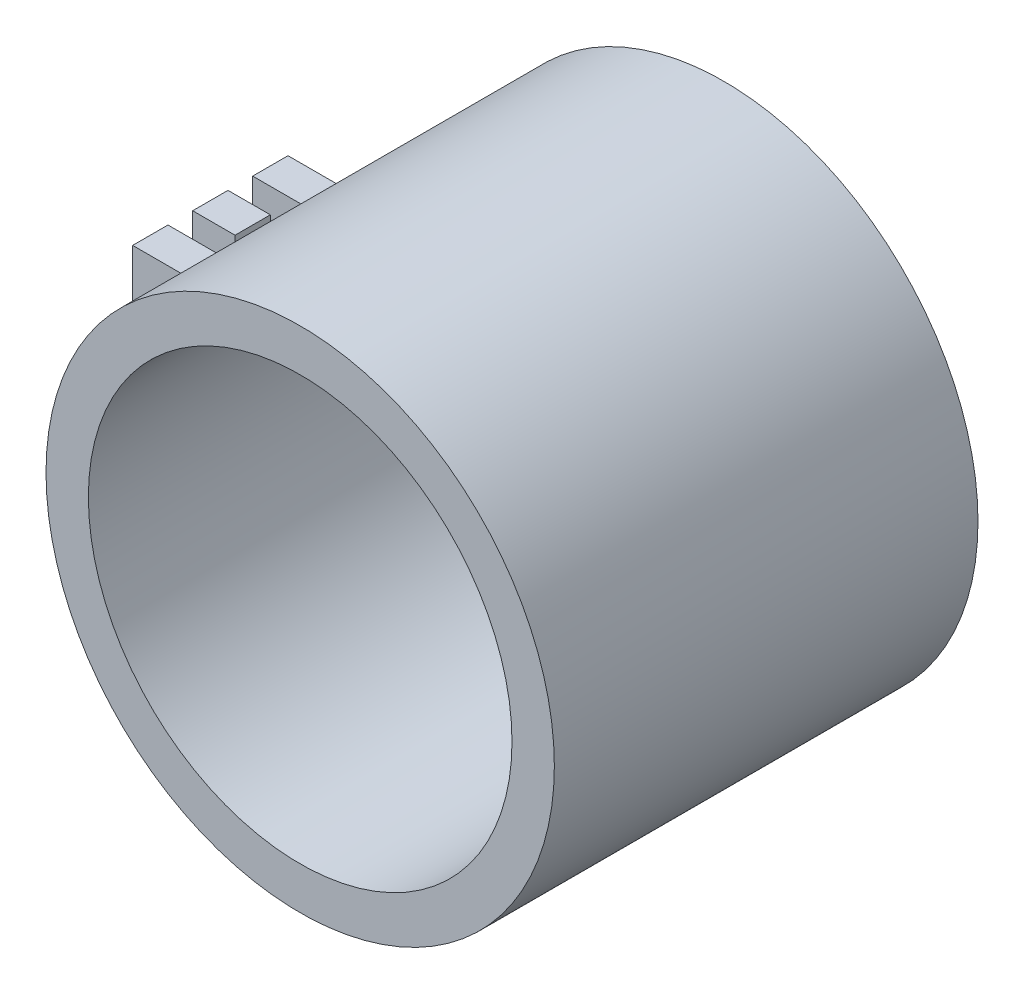
ISO-10303-21;
HEADER;
FILE_DESCRIPTION(('STEP AP214'),'2;1');
FILE_NAME('part.step','',(''),(''),'','','');
FILE_SCHEMA(('AUTOMOTIVE_DESIGN { 1 0 10303 214 1 1 1 1 }'));
ENDSEC;
DATA;
#1=APPLICATION_CONTEXT('core data for automotive mechanical design processes');
#2=APPLICATION_PROTOCOL_DEFINITION('international standard','automotive_design',2000,#1);
#3=PRODUCT_CONTEXT('',#1,'mechanical');
#4=PRODUCT('Part','Part','',(#3));
#5=PRODUCT_RELATED_PRODUCT_CATEGORY('part','',(#4));
#6=PRODUCT_DEFINITION_FORMATION('','',#4);
#7=PRODUCT_DEFINITION_CONTEXT('part definition',#1,'design');
#8=PRODUCT_DEFINITION('design','',#6,#7);
#9=PRODUCT_DEFINITION_SHAPE('','',#8);
#10=(LENGTH_UNIT() NAMED_UNIT(*) SI_UNIT(.MILLI.,.METRE.));
#11=(NAMED_UNIT(*) PLANE_ANGLE_UNIT() SI_UNIT($,.RADIAN.));
#12=(NAMED_UNIT(*) SI_UNIT($,.STERADIAN.) SOLID_ANGLE_UNIT());
#13=UNCERTAINTY_MEASURE_WITH_UNIT(LENGTH_MEASURE(1.E-05),#10,'distance_accuracy_value','');
#14=(GEOMETRIC_REPRESENTATION_CONTEXT(3) GLOBAL_UNCERTAINTY_ASSIGNED_CONTEXT((#13)) GLOBAL_UNIT_ASSIGNED_CONTEXT((#10,
#11,#12)) REPRESENTATION_CONTEXT('',''));
#15=CARTESIAN_POINT('',(0.,0.,0.));
#16=DIRECTION('',(0.,0.,1.));
#17=DIRECTION('',(1.,0.,0.));
#18=AXIS2_PLACEMENT_3D('',#15,#16,#17);
#19=CARTESIAN_POINT('',(0.,0.,60.));
#20=DIRECTION('',(0.,0.,-1.));
#21=DIRECTION('',(-1.,0.,0.));
#22=AXIS2_PLACEMENT_3D('',#19,#20,#21);
#23=CYLINDRICAL_SURFACE('',#22,36.);
#24=DIRECTION('',(0.,0.,-1.));
#25=VECTOR('',#24,1.);
#26=CARTESIAN_POINT('',(-35.4964786985977,-6.,60.));
#27=LINE('',#26,#25);
#28=CARTESIAN_POINT('',(-35.4964786985977,-6.,32.5));
#29=VERTEX_POINT('',#28);
#30=CARTESIAN_POINT('',(-35.4964786985977,-6.,27.5));
#31=VERTEX_POINT('',#30);
#32=EDGE_CURVE('E41',#29,#31,#27,.T.);
#33=ORIENTED_EDGE('',*,*,#32,.T.);
#34=CARTESIAN_POINT('',(0.,0.,27.5));
#35=DIRECTION('',(0.,0.,-1.));
#36=DIRECTION('',(-1.,0.,0.));
#37=AXIS2_PLACEMENT_3D('',#34,#35,#36);
#38=CIRCLE('',#37,36.);
#39=CARTESIAN_POINT('',(-35.8966085520295,-2.72644355568969,27.5));
#40=VERTEX_POINT('',#39);
#41=EDGE_CURVE('E11',#31,#40,#38,.T.);
#42=ORIENTED_EDGE('',*,*,#41,.T.);
#43=DIRECTION('',(0.,0.,-1.));
#44=VECTOR('',#43,1.);
#45=CARTESIAN_POINT('',(-35.8966085520295,-2.72644355568969,60.));
#46=LINE('',#45,#44);
#47=CARTESIAN_POINT('',(-35.8966085520295,-2.72644355568969,32.5));
#48=VERTEX_POINT('',#47);
#49=EDGE_CURVE('E308',#40,#48,#46,.F.);
#50=ORIENTED_EDGE('',*,*,#49,.T.);
#51=CARTESIAN_POINT('',(0.,0.,32.5));
#52=DIRECTION('',(0.,0.,-1.));
#53=DIRECTION('',(-1.,0.,0.));
#54=AXIS2_PLACEMENT_3D('',#51,#52,#53);
#55=CIRCLE('',#54,36.);
#56=EDGE_CURVE('E162',#29,#48,#55,.T.);
#57=ORIENTED_EDGE('',*,*,#56,.F.);
#58=EDGE_LOOP('',(#33,#42,#50,#57));
#59=FACE_BOUND('',#58,.T.);
#60=CARTESIAN_POINT('',(0.,0.,19.));
#61=DIRECTION('',(0.,0.,-1.));
#62=DIRECTION('',(1.,0.,0.));
#63=AXIS2_PLACEMENT_3D('',#60,#61,#62);
#64=CIRCLE('',#63,36.);
#65=CARTESIAN_POINT('',(-34.0366056112419,11.7264435556897,19.));
#66=VERTEX_POINT('',#65);
#67=CARTESIAN_POINT('',(-32.7261363439071,15.,19.));
#68=VERTEX_POINT('',#67);
#69=EDGE_CURVE('E247',#66,#68,#64,.T.);
#70=ORIENTED_EDGE('',*,*,#69,.T.);
#71=DIRECTION('',(0.,0.,1.));
#72=VECTOR('',#71,1.);
#73=CARTESIAN_POINT('',(-32.7261363439071,15.,19.));
#74=LINE('',#73,#72);
#75=CARTESIAN_POINT('',(-32.7261363439071,15.,24.));
#76=VERTEX_POINT('',#75);
#77=EDGE_CURVE('E265',#68,#76,#74,.T.);
#78=ORIENTED_EDGE('',*,*,#77,.T.);
#79=CARTESIAN_POINT('',(0.,0.,24.));
#80=DIRECTION('',(0.,0.,-1.));
#81=DIRECTION('',(1.,0.,0.));
#82=AXIS2_PLACEMENT_3D('',#79,#80,#81);
#83=CIRCLE('',#82,36.);
#84=CARTESIAN_POINT('',(-34.0366056112419,11.7264435556897,24.));
#85=VERTEX_POINT('',#84);
#86=EDGE_CURVE('E232',#85,#76,#83,.T.);
#87=ORIENTED_EDGE('',*,*,#86,.F.);
#88=DIRECTION('',(0.,0.,1.));
#89=VECTOR('',#88,1.);
#90=CARTESIAN_POINT('',(-34.0366056112419,11.7264435556897,19.));
#91=LINE('',#90,#89);
#92=EDGE_CURVE('E281',#66,#85,#91,.T.);
#93=ORIENTED_EDGE('',*,*,#92,.F.);
#94=EDGE_LOOP('',(#70,#78,#87,#93));
#95=FACE_BOUND('',#94,.T.);
#96=CARTESIAN_POINT('',(0.,0.,60.));
#97=DIRECTION('',(0.,0.,1.));
#98=DIRECTION('',(1.,0.,0.));
#99=AXIS2_PLACEMENT_3D('',#96,#97,#98);
#100=CIRCLE('',#99,36.);
#101=CARTESIAN_POINT('',(36.,0.,60.));
#102=VERTEX_POINT('',#101);
#103=EDGE_CURVE('E302',#102,#102,#100,.T.);
#104=ORIENTED_EDGE('',*,*,#103,.F.);
#105=EDGE_LOOP('',(#104));
#106=FACE_BOUND('',#105,.T.);
#107=CARTESIAN_POINT('',(0.,0.,0.));
#108=DIRECTION('',(0.,0.,1.));
#109=DIRECTION('',(1.,0.,0.));
#110=AXIS2_PLACEMENT_3D('',#107,#108,#109);
#111=CIRCLE('',#110,36.);
#112=CARTESIAN_POINT('',(36.,0.,0.));
#113=VERTEX_POINT('',#112);
#114=EDGE_CURVE('E299',#113,#113,#111,.T.);
#115=ORIENTED_EDGE('',*,*,#114,.T.);
#116=EDGE_LOOP('',(#115));
#117=FACE_BOUND('',#116,.T.);
#118=CARTESIAN_POINT('',(0.,0.,41.));
#119=DIRECTION('',(0.,0.,-1.));
#120=DIRECTION('',(1.,0.,0.));
#121=AXIS2_PLACEMENT_3D('',#118,#119,#120);
#122=CIRCLE('',#121,36.);
#123=CARTESIAN_POINT('',(-34.0366056112419,11.7264435556897,41.));
#124=VERTEX_POINT('',#123);
#125=CARTESIAN_POINT('',(-32.7261363439071,15.,41.));
#126=VERTEX_POINT('',#125);
#127=EDGE_CURVE('E203',#124,#126,#122,.T.);
#128=ORIENTED_EDGE('',*,*,#127,.F.);
#129=DIRECTION('',(0.,0.,-1.));
#130=VECTOR('',#129,1.);
#131=CARTESIAN_POINT('',(-34.0366056112419,11.7264435556897,41.));
#132=LINE('',#131,#130);
#133=CARTESIAN_POINT('',(-34.0366056112419,11.7264435556897,36.));
#134=VERTEX_POINT('',#133);
#135=EDGE_CURVE('E218',#124,#134,#132,.T.);
#136=ORIENTED_EDGE('',*,*,#135,.T.);
#137=CARTESIAN_POINT('',(0.,0.,36.));
#138=DIRECTION('',(0.,0.,-1.));
#139=DIRECTION('',(1.,0.,0.));
#140=AXIS2_PLACEMENT_3D('',#137,#138,#139);
#141=CIRCLE('',#140,36.);
#142=CARTESIAN_POINT('',(-32.7261363439071,15.,36.));
#143=VERTEX_POINT('',#142);
#144=EDGE_CURVE('E199',#134,#143,#141,.T.);
#145=ORIENTED_EDGE('',*,*,#144,.T.);
#146=DIRECTION('',(0.,0.,-1.));
#147=VECTOR('',#146,1.);
#148=CARTESIAN_POINT('',(-32.7261363439071,15.,41.));
#149=LINE('',#148,#147);
#150=EDGE_CURVE('E230',#126,#143,#149,.T.);
#151=ORIENTED_EDGE('',*,*,#150,.F.);
#152=EDGE_LOOP('',(#128,#136,#145,#151));
#153=FACE_BOUND('',#152,.T.);
#154=ADVANCED_FACE('F33',(#59,#95,#106,#117,#153),#23,.T.);
#155=CARTESIAN_POINT('',(0.,0.,60.));
#156=DIRECTION('',(0.,0.,1.));
#157=DIRECTION('',(1.,0.,0.));
#158=AXIS2_PLACEMENT_3D('',#155,#156,#157);
#159=PLANE('',#158);
#160=CARTESIAN_POINT('',(0.,0.,60.));
#161=DIRECTION('',(0.,0.,1.));
#162=DIRECTION('',(1.,0.,0.));
#163=AXIS2_PLACEMENT_3D('',#160,#161,#162);
#164=CIRCLE('',#163,30.);
#165=CARTESIAN_POINT('',(30.,0.,60.));
#166=VERTEX_POINT('',#165);
#167=EDGE_CURVE('E284',#166,#166,#164,.T.);
#168=ORIENTED_EDGE('',*,*,#167,.F.);
#169=EDGE_LOOP('',(#168));
#170=FACE_BOUND('',#169,.T.);
#171=ORIENTED_EDGE('',*,*,#103,.T.);
#172=EDGE_LOOP('',(#171));
#173=FACE_BOUND('',#172,.T.);
#174=ADVANCED_FACE('F360',(#170,#173),#159,.T.);
#175=CARTESIAN_POINT('',(0.,0.,0.));
#176=DIRECTION('',(0.,0.,1.));
#177=DIRECTION('',(1.,0.,0.));
#178=AXIS2_PLACEMENT_3D('',#175,#176,#177);
#179=PLANE('',#178);
#180=CARTESIAN_POINT('',(0.,0.,0.));
#181=DIRECTION('',(0.,0.,1.));
#182=DIRECTION('',(1.,0.,0.));
#183=AXIS2_PLACEMENT_3D('',#180,#181,#182);
#184=CIRCLE('',#183,30.);
#185=CARTESIAN_POINT('',(30.,0.,0.));
#186=VERTEX_POINT('',#185);
#187=EDGE_CURVE('E296',#186,#186,#184,.T.);
#188=ORIENTED_EDGE('',*,*,#187,.T.);
#189=EDGE_LOOP('',(#188));
#190=FACE_BOUND('',#189,.T.);
#191=ORIENTED_EDGE('',*,*,#114,.F.);
#192=EDGE_LOOP('',(#191));
#193=FACE_BOUND('',#192,.T.);
#194=ADVANCED_FACE('F364',(#190,#193),#179,.F.);
#195=CARTESIAN_POINT('',(0.,0.,0.));
#196=DIRECTION('',(0.,0.,1.));
#197=DIRECTION('',(1.,0.,0.));
#198=AXIS2_PLACEMENT_3D('',#195,#196,#197);
#199=CYLINDRICAL_SURFACE('',#198,30.);
#200=ORIENTED_EDGE('',*,*,#187,.F.);
#201=EDGE_LOOP('',(#200));
#202=FACE_BOUND('',#201,.T.);
#203=ORIENTED_EDGE('',*,*,#167,.T.);
#204=EDGE_LOOP('',(#203));
#205=FACE_BOUND('',#204,.T.);
#206=ADVANCED_FACE('F370',(#202,#205),#199,.F.);
#207=CARTESIAN_POINT('',(-34.0366056112419,11.7264435556897,19.));
#208=DIRECTION('',(0.,-1.,0.));
#209=DIRECTION('',(1.,0.,0.));
#210=AXIS2_PLACEMENT_3D('',#207,#208,#209);
#211=PLANE('',#210);
#212=DIRECTION('',(1.,0.,0.));
#213=VECTOR('',#212,1.);
#214=CARTESIAN_POINT('',(-34.0366056112419,11.7264435556897,24.));
#215=LINE('',#214,#213);
#216=CARTESIAN_POINT('',(-36.7261363439071,11.7264435556897,24.));
#217=VERTEX_POINT('',#216);
#218=EDGE_CURVE('E251',#217,#85,#215,.T.);
#219=ORIENTED_EDGE('',*,*,#218,.F.);
#220=DIRECTION('',(0.,0.,1.));
#221=VECTOR('',#220,1.);
#222=CARTESIAN_POINT('',(-36.7261363439071,11.7264435556897,19.));
#223=LINE('',#222,#221);
#224=CARTESIAN_POINT('',(-36.7261363439071,11.7264435556897,19.));
#225=VERTEX_POINT('',#224);
#226=EDGE_CURVE('E285',#225,#217,#223,.T.);
#227=ORIENTED_EDGE('',*,*,#226,.F.);
#228=DIRECTION('',(1.,0.,0.));
#229=VECTOR('',#228,1.);
#230=CARTESIAN_POINT('',(-34.0366056112419,11.7264435556897,19.));
#231=LINE('',#230,#229);
#232=EDGE_CURVE('E262',#225,#66,#231,.T.);
#233=ORIENTED_EDGE('',*,*,#232,.T.);
#234=ORIENTED_EDGE('',*,*,#92,.T.);
#235=EDGE_LOOP('',(#219,#227,#233,#234));
#236=FACE_BOUND('',#235,.T.);
#237=ADVANCED_FACE('F377',(#236),#211,.T.);
#238=CARTESIAN_POINT('',(-36.7261363439071,11.7264435556897,19.));
#239=DIRECTION('',(1.,0.,0.));
#240=DIRECTION('',(0.,1.,0.));
#241=AXIS2_PLACEMENT_3D('',#238,#239,#240);
#242=PLANE('',#241);
#243=DIRECTION('',(0.,1.,0.));
#244=VECTOR('',#243,1.);
#245=CARTESIAN_POINT('',(-36.7261363439071,11.7264435556897,24.));
#246=LINE('',#245,#244);
#247=CARTESIAN_POINT('',(-36.7261363439071,-6.,24.));
#248=VERTEX_POINT('',#247);
#249=EDGE_CURVE('E277',#248,#217,#246,.T.);
#250=ORIENTED_EDGE('',*,*,#249,.F.);
#251=DIRECTION('',(0.,0.,1.));
#252=VECTOR('',#251,1.);
#253=CARTESIAN_POINT('',(-36.7261363439071,-6.,19.));
#254=LINE('',#253,#252);
#255=CARTESIAN_POINT('',(-36.7261363439071,-6.,19.));
#256=VERTEX_POINT('',#255);
#257=EDGE_CURVE('E287',#256,#248,#254,.T.);
#258=ORIENTED_EDGE('',*,*,#257,.F.);
#259=DIRECTION('',(0.,1.,0.));
#260=VECTOR('',#259,1.);
#261=CARTESIAN_POINT('',(-36.7261363439071,11.7264435556897,19.));
#262=LINE('',#261,#260);
#263=EDGE_CURVE('E259',#256,#225,#262,.T.);
#264=ORIENTED_EDGE('',*,*,#263,.T.);
#265=ORIENTED_EDGE('',*,*,#226,.T.);
#266=EDGE_LOOP('',(#250,#258,#264,#265));
#267=FACE_BOUND('',#266,.T.);
#268=ADVANCED_FACE('F391',(#267),#242,.T.);
#269=CARTESIAN_POINT('',(-42.7261363439071,-6.,19.));
#270=DIRECTION('',(0.,-1.,0.));
#271=DIRECTION('',(0.,0.,-1.));
#272=AXIS2_PLACEMENT_3D('',#269,#270,#271);
#273=PLANE('',#272);
#274=DIRECTION('',(1.,0.,0.));
#275=VECTOR('',#274,1.);
#276=CARTESIAN_POINT('',(-42.7261363439071,-6.,24.));
#277=LINE('',#276,#275);
#278=CARTESIAN_POINT('',(-42.7261363439071,-6.,24.));
#279=VERTEX_POINT('',#278);
#280=EDGE_CURVE('E274',#279,#248,#277,.T.);
#281=ORIENTED_EDGE('',*,*,#280,.F.);
#282=DIRECTION('',(0.,0.,1.));
#283=VECTOR('',#282,1.);
#284=CARTESIAN_POINT('',(-42.7261363439071,-6.,19.));
#285=LINE('',#284,#283);
#286=CARTESIAN_POINT('',(-42.7261363439071,-6.,19.));
#287=VERTEX_POINT('',#286);
#288=EDGE_CURVE('E289',#287,#279,#285,.T.);
#289=ORIENTED_EDGE('',*,*,#288,.F.);
#290=DIRECTION('',(1.,0.,0.));
#291=VECTOR('',#290,1.);
#292=CARTESIAN_POINT('',(-42.7261363439071,-6.,19.));
#293=LINE('',#292,#291);
#294=EDGE_CURVE('E256',#287,#256,#293,.T.);
#295=ORIENTED_EDGE('',*,*,#294,.T.);
#296=ORIENTED_EDGE('',*,*,#257,.T.);
#297=EDGE_LOOP('',(#281,#289,#295,#296));
#298=FACE_BOUND('',#297,.T.);
#299=ADVANCED_FACE('F387',(#298),#273,.T.);
#300=CARTESIAN_POINT('',(-42.7261363439071,0.,19.));
#301=DIRECTION('',(-1.,0.,0.));
#302=DIRECTION('',(0.,0.,1.));
#303=AXIS2_PLACEMENT_3D('',#300,#301,#302);
#304=PLANE('',#303);
#305=DIRECTION('',(0.,-1.,0.));
#306=VECTOR('',#305,1.);
#307=CARTESIAN_POINT('',(-42.7261363439071,0.,24.));
#308=LINE('',#307,#306);
#309=CARTESIAN_POINT('',(-42.7261363439071,15.,24.));
#310=VERTEX_POINT('',#309);
#311=EDGE_CURVE('E271',#310,#279,#308,.T.);
#312=ORIENTED_EDGE('',*,*,#311,.F.);
#313=DIRECTION('',(0.,0.,1.));
#314=VECTOR('',#313,1.);
#315=CARTESIAN_POINT('',(-42.7261363439071,15.,19.));
#316=LINE('',#315,#314);
#317=CARTESIAN_POINT('',(-42.7261363439071,15.,19.));
#318=VERTEX_POINT('',#317);
#319=EDGE_CURVE('E291',#318,#310,#316,.T.);
#320=ORIENTED_EDGE('',*,*,#319,.F.);
#321=DIRECTION('',(0.,-1.,0.));
#322=VECTOR('',#321,1.);
#323=CARTESIAN_POINT('',(-42.7261363439071,15.,19.));
#324=LINE('',#323,#322);
#325=EDGE_CURVE('E254',#318,#287,#324,.T.);
#326=ORIENTED_EDGE('',*,*,#325,.T.);
#327=ORIENTED_EDGE('',*,*,#288,.T.);
#328=EDGE_LOOP('',(#312,#320,#326,#327));
#329=FACE_BOUND('',#328,.T.);
#330=ADVANCED_FACE('F383',(#329),#304,.T.);
#331=CARTESIAN_POINT('',(-32.7261363439071,15.,19.));
#332=DIRECTION('',(0.,1.,0.));
#333=DIRECTION('',(-1.,0.,0.));
#334=AXIS2_PLACEMENT_3D('',#331,#332,#333);
#335=PLANE('',#334);
#336=DIRECTION('',(-1.,0.,0.));
#337=VECTOR('',#336,1.);
#338=CARTESIAN_POINT('',(-32.7261363439071,15.,24.));
#339=LINE('',#338,#337);
#340=EDGE_CURVE('E268',#76,#310,#339,.T.);
#341=ORIENTED_EDGE('',*,*,#340,.F.);
#342=ORIENTED_EDGE('',*,*,#77,.F.);
#343=DIRECTION('',(-1.,0.,0.));
#344=VECTOR('',#343,1.);
#345=CARTESIAN_POINT('',(-32.7261363439071,15.,19.));
#346=LINE('',#345,#344);
#347=EDGE_CURVE('E250',#68,#318,#346,.T.);
#348=ORIENTED_EDGE('',*,*,#347,.T.);
#349=ORIENTED_EDGE('',*,*,#319,.T.);
#350=EDGE_LOOP('',(#341,#342,#348,#349));
#351=FACE_BOUND('',#350,.T.);
#352=ADVANCED_FACE('F379',(#351),#335,.T.);
#353=CARTESIAN_POINT('',(0.,0.,19.));
#354=DIRECTION('',(0.,0.,1.));
#355=DIRECTION('',(1.,0.,0.));
#356=AXIS2_PLACEMENT_3D('',#353,#354,#355);
#357=PLANE('',#356);
#358=CARTESIAN_POINT('',(-39.7261363439071,-1.,19.));
#359=DIRECTION('',(0.,0.,1.));
#360=DIRECTION('',(1.,0.,0.));
#361=AXIS2_PLACEMENT_3D('',#358,#359,#360);
#362=CIRCLE('',#361,2.5);
#363=CARTESIAN_POINT('',(-37.2261363439071,-1.,19.));
#364=VERTEX_POINT('',#363);
#365=EDGE_CURVE('E324',#364,#364,#362,.T.);
#366=ORIENTED_EDGE('',*,*,#365,.T.);
#367=EDGE_LOOP('',(#366));
#368=FACE_BOUND('',#367,.T.);
#369=ORIENTED_EDGE('',*,*,#69,.F.);
#370=ORIENTED_EDGE('',*,*,#232,.F.);
#371=ORIENTED_EDGE('',*,*,#263,.F.);
#372=ORIENTED_EDGE('',*,*,#294,.F.);
#373=ORIENTED_EDGE('',*,*,#325,.F.);
#374=ORIENTED_EDGE('',*,*,#347,.F.);
#375=EDGE_LOOP('',(#369,#370,#371,#372,#373,#374));
#376=FACE_BOUND('',#375,.T.);
#377=ADVANCED_FACE('F382',(#368,#376),#357,.F.);
#378=CARTESIAN_POINT('',(0.,0.,24.));
#379=DIRECTION('',(0.,0.,1.));
#380=DIRECTION('',(1.,0.,0.));
#381=AXIS2_PLACEMENT_3D('',#378,#379,#380);
#382=PLANE('',#381);
#383=CARTESIAN_POINT('',(-39.7261363439071,-1.,24.));
#384=DIRECTION('',(0.,0.,1.));
#385=DIRECTION('',(1.,0.,0.));
#386=AXIS2_PLACEMENT_3D('',#383,#384,#385);
#387=CIRCLE('',#386,2.5);
#388=CARTESIAN_POINT('',(-37.2261363439071,-1.,24.));
#389=VERTEX_POINT('',#388);
#390=EDGE_CURVE('E326',#389,#389,#387,.T.);
#391=ORIENTED_EDGE('',*,*,#390,.F.);
#392=EDGE_LOOP('',(#391));
#393=FACE_BOUND('',#392,.T.);
#394=ORIENTED_EDGE('',*,*,#86,.T.);
#395=ORIENTED_EDGE('',*,*,#340,.T.);
#396=ORIENTED_EDGE('',*,*,#311,.T.);
#397=ORIENTED_EDGE('',*,*,#280,.T.);
#398=ORIENTED_EDGE('',*,*,#249,.T.);
#399=ORIENTED_EDGE('',*,*,#218,.T.);
#400=EDGE_LOOP('',(#394,#395,#396,#397,#398,#399));
#401=FACE_BOUND('',#400,.T.);
#402=ADVANCED_FACE('F399',(#393,#401),#382,.T.);
#403=CARTESIAN_POINT('',(-32.7261363439071,15.,41.));
#404=DIRECTION('',(0.,-1.,0.));
#405=DIRECTION('',(1.,0.,0.));
#406=AXIS2_PLACEMENT_3D('',#403,#404,#405);
#407=PLANE('',#406);
#408=DIRECTION('',(-1.,0.,0.));
#409=VECTOR('',#408,1.);
#410=CARTESIAN_POINT('',(-32.7261363439071,15.,36.));
#411=LINE('',#410,#409);
#412=CARTESIAN_POINT('',(-42.7261363439071,15.,36.));
#413=VERTEX_POINT('',#412);
#414=EDGE_CURVE('E207',#143,#413,#411,.T.);
#415=ORIENTED_EDGE('',*,*,#414,.T.);
#416=DIRECTION('',(0.,0.,-1.));
#417=VECTOR('',#416,1.);
#418=CARTESIAN_POINT('',(-42.7261363439071,15.,41.));
#419=LINE('',#418,#417);
#420=CARTESIAN_POINT('',(-42.7261363439071,15.,41.));
#421=VERTEX_POINT('',#420);
#422=EDGE_CURVE('E233',#421,#413,#419,.T.);
#423=ORIENTED_EDGE('',*,*,#422,.F.);
#424=DIRECTION('',(-1.,0.,0.));
#425=VECTOR('',#424,1.);
#426=CARTESIAN_POINT('',(-32.7261363439071,15.,41.));
#427=LINE('',#426,#425);
#428=EDGE_CURVE('E215',#126,#421,#427,.T.);
#429=ORIENTED_EDGE('',*,*,#428,.F.);
#430=ORIENTED_EDGE('',*,*,#150,.T.);
#431=EDGE_LOOP('',(#415,#423,#429,#430));
#432=FACE_BOUND('',#431,.T.);
#433=ADVANCED_FACE('F402',(#432),#407,.F.);
#434=CARTESIAN_POINT('',(-42.7261363439071,15.,41.));
#435=DIRECTION('',(1.,0.,0.));
#436=DIRECTION('',(0.,0.,-1.));
#437=AXIS2_PLACEMENT_3D('',#434,#435,#436);
#438=PLANE('',#437);
#439=DIRECTION('',(0.,-1.,0.));
#440=VECTOR('',#439,1.);
#441=CARTESIAN_POINT('',(-42.7261363439071,15.,36.));
#442=LINE('',#441,#440);
#443=CARTESIAN_POINT('',(-42.7261363439071,-6.,36.));
#444=VERTEX_POINT('',#443);
#445=EDGE_CURVE('E227',#413,#444,#442,.T.);
#446=ORIENTED_EDGE('',*,*,#445,.T.);
#447=DIRECTION('',(0.,0.,-1.));
#448=VECTOR('',#447,1.);
#449=CARTESIAN_POINT('',(-42.7261363439071,-6.,41.));
#450=LINE('',#449,#448);
#451=CARTESIAN_POINT('',(-42.7261363439071,-6.,41.));
#452=VERTEX_POINT('',#451);
#453=EDGE_CURVE('E236',#452,#444,#450,.T.);
#454=ORIENTED_EDGE('',*,*,#453,.F.);
#455=DIRECTION('',(0.,-1.,0.));
#456=VECTOR('',#455,1.);
#457=CARTESIAN_POINT('',(-42.7261363439071,0.,41.));
#458=LINE('',#457,#456);
#459=EDGE_CURVE('E213',#421,#452,#458,.T.);
#460=ORIENTED_EDGE('',*,*,#459,.F.);
#461=ORIENTED_EDGE('',*,*,#422,.T.);
#462=EDGE_LOOP('',(#446,#454,#460,#461));
#463=FACE_BOUND('',#462,.T.);
#464=ADVANCED_FACE('F419',(#463),#438,.F.);
#465=CARTESIAN_POINT('',(-42.7261363439071,-6.,41.));
#466=DIRECTION('',(0.,1.,0.));
#467=DIRECTION('',(0.,0.,1.));
#468=AXIS2_PLACEMENT_3D('',#465,#466,#467);
#469=PLANE('',#468);
#470=DIRECTION('',(1.,0.,0.));
#471=VECTOR('',#470,1.);
#472=CARTESIAN_POINT('',(-42.7261363439071,-6.,36.));
#473=LINE('',#472,#471);
#474=CARTESIAN_POINT('',(-36.7261363439071,-6.,36.));
#475=VERTEX_POINT('',#474);
#476=EDGE_CURVE('E225',#444,#475,#473,.T.);
#477=ORIENTED_EDGE('',*,*,#476,.T.);
#478=DIRECTION('',(0.,0.,-1.));
#479=VECTOR('',#478,1.);
#480=CARTESIAN_POINT('',(-36.7261363439071,-6.,41.));
#481=LINE('',#480,#479);
#482=CARTESIAN_POINT('',(-36.7261363439071,-6.,41.));
#483=VERTEX_POINT('',#482);
#484=EDGE_CURVE('E239',#483,#475,#481,.T.);
#485=ORIENTED_EDGE('',*,*,#484,.F.);
#486=DIRECTION('',(1.,0.,0.));
#487=VECTOR('',#486,1.);
#488=CARTESIAN_POINT('',(-42.7261363439071,-6.,41.));
#489=LINE('',#488,#487);
#490=EDGE_CURVE('E211',#452,#483,#489,.T.);
#491=ORIENTED_EDGE('',*,*,#490,.F.);
#492=ORIENTED_EDGE('',*,*,#453,.T.);
#493=EDGE_LOOP('',(#477,#485,#491,#492));
#494=FACE_BOUND('',#493,.T.);
#495=ADVANCED_FACE('F415',(#494),#469,.F.);
#496=CARTESIAN_POINT('',(-36.7261363439071,11.7264435556897,41.));
#497=DIRECTION('',(-1.,0.,0.));
#498=DIRECTION('',(0.,-1.,0.));
#499=AXIS2_PLACEMENT_3D('',#496,#497,#498);
#500=PLANE('',#499);
#501=DIRECTION('',(0.,1.,0.));
#502=VECTOR('',#501,1.);
#503=CARTESIAN_POINT('',(-36.7261363439071,11.7264435556897,36.));
#504=LINE('',#503,#502);
#505=CARTESIAN_POINT('',(-36.7261363439071,11.7264435556897,36.));
#506=VERTEX_POINT('',#505);
#507=EDGE_CURVE('E223',#475,#506,#504,.T.);
#508=ORIENTED_EDGE('',*,*,#507,.T.);
#509=DIRECTION('',(0.,0.,-1.));
#510=VECTOR('',#509,1.);
#511=CARTESIAN_POINT('',(-36.7261363439071,11.7264435556897,41.));
#512=LINE('',#511,#510);
#513=CARTESIAN_POINT('',(-36.7261363439071,11.7264435556897,41.));
#514=VERTEX_POINT('',#513);
#515=EDGE_CURVE('E242',#514,#506,#512,.T.);
#516=ORIENTED_EDGE('',*,*,#515,.F.);
#517=DIRECTION('',(0.,1.,0.));
#518=VECTOR('',#517,1.);
#519=CARTESIAN_POINT('',(-36.7261363439071,11.7264435556897,41.));
#520=LINE('',#519,#518);
#521=EDGE_CURVE('E209',#483,#514,#520,.T.);
#522=ORIENTED_EDGE('',*,*,#521,.F.);
#523=ORIENTED_EDGE('',*,*,#484,.T.);
#524=EDGE_LOOP('',(#508,#516,#522,#523));
#525=FACE_BOUND('',#524,.T.);
#526=ADVANCED_FACE('F411',(#525),#500,.F.);
#527=CARTESIAN_POINT('',(-34.0366056112419,11.7264435556897,41.));
#528=DIRECTION('',(0.,1.,0.));
#529=DIRECTION('',(-1.,0.,0.));
#530=AXIS2_PLACEMENT_3D('',#527,#528,#529);
#531=PLANE('',#530);
#532=DIRECTION('',(1.,0.,0.));
#533=VECTOR('',#532,1.);
#534=CARTESIAN_POINT('',(-34.0366056112419,11.7264435556897,36.));
#535=LINE('',#534,#533);
#536=EDGE_CURVE('E221',#506,#134,#535,.T.);
#537=ORIENTED_EDGE('',*,*,#536,.T.);
#538=ORIENTED_EDGE('',*,*,#135,.F.);
#539=DIRECTION('',(1.,0.,0.));
#540=VECTOR('',#539,1.);
#541=CARTESIAN_POINT('',(-34.0366056112419,11.7264435556897,41.));
#542=LINE('',#541,#540);
#543=EDGE_CURVE('E206',#514,#124,#542,.T.);
#544=ORIENTED_EDGE('',*,*,#543,.F.);
#545=ORIENTED_EDGE('',*,*,#515,.T.);
#546=EDGE_LOOP('',(#537,#538,#544,#545));
#547=FACE_BOUND('',#546,.T.);
#548=ADVANCED_FACE('F407',(#547),#531,.F.);
#549=CARTESIAN_POINT('',(0.,0.,41.));
#550=DIRECTION('',(0.,0.,-1.));
#551=DIRECTION('',(1.,0.,0.));
#552=AXIS2_PLACEMENT_3D('',#549,#550,#551);
#553=PLANE('',#552);
#554=CARTESIAN_POINT('',(-39.7261363439071,-1.,41.));
#555=DIRECTION('',(0.,0.,1.));
#556=DIRECTION('',(1.,0.,0.));
#557=AXIS2_PLACEMENT_3D('',#554,#555,#556);
#558=CIRCLE('',#557,2.5);
#559=CARTESIAN_POINT('',(-37.2261363439071,-1.,41.));
#560=VERTEX_POINT('',#559);
#561=EDGE_CURVE('E337',#560,#560,#558,.T.);
#562=ORIENTED_EDGE('',*,*,#561,.F.);
#563=EDGE_LOOP('',(#562));
#564=FACE_BOUND('',#563,.T.);
#565=ORIENTED_EDGE('',*,*,#127,.T.);
#566=ORIENTED_EDGE('',*,*,#428,.T.);
#567=ORIENTED_EDGE('',*,*,#459,.T.);
#568=ORIENTED_EDGE('',*,*,#490,.T.);
#569=ORIENTED_EDGE('',*,*,#521,.T.);
#570=ORIENTED_EDGE('',*,*,#543,.T.);
#571=EDGE_LOOP('',(#565,#566,#567,#568,#569,#570));
#572=FACE_BOUND('',#571,.T.);
#573=ADVANCED_FACE('F410',(#564,#572),#553,.F.);
#574=CARTESIAN_POINT('',(0.,0.,36.));
#575=DIRECTION('',(0.,0.,-1.));
#576=DIRECTION('',(1.,0.,0.));
#577=AXIS2_PLACEMENT_3D('',#574,#575,#576);
#578=PLANE('',#577);
#579=CARTESIAN_POINT('',(-39.7261363439071,-1.,36.));
#580=DIRECTION('',(0.,0.,-1.));
#581=DIRECTION('',(-1.,0.,0.));
#582=AXIS2_PLACEMENT_3D('',#579,#580,#581);
#583=CIRCLE('',#582,2.5);
#584=CARTESIAN_POINT('',(-42.2261363439071,-1.,36.));
#585=VERTEX_POINT('',#584);
#586=EDGE_CURVE('E331',#585,#585,#583,.T.);
#587=ORIENTED_EDGE('',*,*,#586,.F.);
#588=EDGE_LOOP('',(#587));
#589=FACE_BOUND('',#588,.T.);
#590=ORIENTED_EDGE('',*,*,#144,.F.);
#591=ORIENTED_EDGE('',*,*,#536,.F.);
#592=ORIENTED_EDGE('',*,*,#507,.F.);
#593=ORIENTED_EDGE('',*,*,#476,.F.);
#594=ORIENTED_EDGE('',*,*,#445,.F.);
#595=ORIENTED_EDGE('',*,*,#414,.F.);
#596=EDGE_LOOP('',(#590,#591,#592,#593,#594,#595));
#597=FACE_BOUND('',#596,.T.);
#598=ADVANCED_FACE('F427',(#589,#597),#578,.T.);
#599=CARTESIAN_POINT('',(-32.7261363439071,-6.,27.5));
#600=DIRECTION('',(0.,-1.,0.));
#601=DIRECTION('',(0.,0.,-1.));
#602=AXIS2_PLACEMENT_3D('',#599,#600,#601);
#603=PLANE('',#602);
#604=ORIENTED_EDGE('',*,*,#32,.F.);
#605=DIRECTION('',(1.,0.,0.));
#606=VECTOR('',#605,1.);
#607=CARTESIAN_POINT('',(-32.7261363439071,-6.,32.5));
#608=LINE('',#607,#606);
#609=CARTESIAN_POINT('',(-42.7261363439071,-6.,32.5));
#610=VERTEX_POINT('',#609);
#611=EDGE_CURVE('E164',#610,#29,#608,.T.);
#612=ORIENTED_EDGE('',*,*,#611,.F.);
#613=DIRECTION('',(0.,0.,1.));
#614=VECTOR('',#613,1.);
#615=CARTESIAN_POINT('',(-42.7261363439071,-6.,27.5));
#616=LINE('',#615,#614);
#617=CARTESIAN_POINT('',(-42.7261363439071,-6.,27.5));
#618=VERTEX_POINT('',#617);
#619=EDGE_CURVE('E197',#618,#610,#616,.T.);
#620=ORIENTED_EDGE('',*,*,#619,.F.);
#621=DIRECTION('',(1.,0.,0.));
#622=VECTOR('',#621,1.);
#623=CARTESIAN_POINT('',(-32.7261363439071,-6.,27.5));
#624=LINE('',#623,#622);
#625=EDGE_CURVE('E186',#618,#31,#624,.T.);
#626=ORIENTED_EDGE('',*,*,#625,.T.);
#627=EDGE_LOOP('',(#604,#612,#620,#626));
#628=FACE_BOUND('',#627,.T.);
#629=ADVANCED_FACE('F323',(#628),#603,.T.);
#630=CARTESIAN_POINT('',(-36.7261363439071,-2.72644355568969,27.5));
#631=DIRECTION('',(0.,1.,0.));
#632=DIRECTION('',(-1.,0.,0.));
#633=AXIS2_PLACEMENT_3D('',#630,#631,#632);
#634=PLANE('',#633);
#635=ORIENTED_EDGE('',*,*,#49,.F.);
#636=DIRECTION('',(-1.,0.,0.));
#637=VECTOR('',#636,1.);
#638=CARTESIAN_POINT('',(-36.7261363439071,-2.72644355568969,27.5));
#639=LINE('',#638,#637);
#640=CARTESIAN_POINT('',(-36.7261363439071,-2.72644355568969,27.5));
#641=VERTEX_POINT('',#640);
#642=EDGE_CURVE('E170',#40,#641,#639,.T.);
#643=ORIENTED_EDGE('',*,*,#642,.T.);
#644=DIRECTION('',(0.,0.,1.));
#645=VECTOR('',#644,1.);
#646=CARTESIAN_POINT('',(-36.7261363439071,-2.72644355568969,27.5));
#647=LINE('',#646,#645);
#648=CARTESIAN_POINT('',(-36.7261363439071,-2.72644355568969,32.5));
#649=VERTEX_POINT('',#648);
#650=EDGE_CURVE('E167',#641,#649,#647,.T.);
#651=ORIENTED_EDGE('',*,*,#650,.T.);
#652=DIRECTION('',(-1.,0.,0.));
#653=VECTOR('',#652,1.);
#654=CARTESIAN_POINT('',(-36.7261363439071,-2.72644355568969,32.5));
#655=LINE('',#654,#653);
#656=EDGE_CURVE('E154',#48,#649,#655,.T.);
#657=ORIENTED_EDGE('',*,*,#656,.F.);
#658=EDGE_LOOP('',(#635,#643,#651,#657));
#659=FACE_BOUND('',#658,.T.);
#660=ADVANCED_FACE('F168',(#659),#634,.T.);
#661=CARTESIAN_POINT('',(-42.7261363439071,15.,27.5));
#662=DIRECTION('',(-1.,0.,0.));
#663=DIRECTION('',(0.,0.,1.));
#664=AXIS2_PLACEMENT_3D('',#661,#662,#663);
#665=PLANE('',#664);
#666=ORIENTED_EDGE('',*,*,#619,.T.);
#667=DIRECTION('',(0.,-1.,0.));
#668=VECTOR('',#667,1.);
#669=CARTESIAN_POINT('',(-42.7261363439071,15.,32.5));
#670=LINE('',#669,#668);
#671=CARTESIAN_POINT('',(-42.7261363439071,15.,32.5));
#672=VERTEX_POINT('',#671);
#673=EDGE_CURVE('E180',#672,#610,#670,.T.);
#674=ORIENTED_EDGE('',*,*,#673,.F.);
#675=DIRECTION('',(0.,0.,1.));
#676=VECTOR('',#675,1.);
#677=CARTESIAN_POINT('',(-42.7261363439071,15.,27.5));
#678=LINE('',#677,#676);
#679=CARTESIAN_POINT('',(-42.7261363439071,15.,27.5));
#680=VERTEX_POINT('',#679);
#681=EDGE_CURVE('E200',#680,#672,#678,.T.);
#682=ORIENTED_EDGE('',*,*,#681,.F.);
#683=DIRECTION('',(0.,-1.,0.));
#684=VECTOR('',#683,1.);
#685=CARTESIAN_POINT('',(-42.7261363439071,15.,27.5));
#686=LINE('',#685,#684);
#687=EDGE_CURVE('E175',#680,#618,#686,.T.);
#688=ORIENTED_EDGE('',*,*,#687,.T.);
#689=EDGE_LOOP('',(#666,#674,#682,#688));
#690=FACE_BOUND('',#689,.T.);
#691=ADVANCED_FACE('F321',(#690),#665,.T.);
#692=CARTESIAN_POINT('',(-36.7261363439071,15.,27.5));
#693=DIRECTION('',(0.,1.,0.));
#694=DIRECTION('',(-1.,0.,0.));
#695=AXIS2_PLACEMENT_3D('',#692,#693,#694);
#696=PLANE('',#695);
#697=ORIENTED_EDGE('',*,*,#681,.T.);
#698=DIRECTION('',(-1.,0.,0.));
#699=VECTOR('',#698,1.);
#700=CARTESIAN_POINT('',(-36.7261363439071,15.,32.5));
#701=LINE('',#700,#699);
#702=CARTESIAN_POINT('',(-36.7261363439071,15.,32.5));
#703=VERTEX_POINT('',#702);
#704=EDGE_CURVE('E178',#703,#672,#701,.T.);
#705=ORIENTED_EDGE('',*,*,#704,.F.);
#706=DIRECTION('',(0.,0.,1.));
#707=VECTOR('',#706,1.);
#708=CARTESIAN_POINT('',(-36.7261363439071,15.,27.5));
#709=LINE('',#708,#707);
#710=CARTESIAN_POINT('',(-36.7261363439071,15.,27.5));
#711=VERTEX_POINT('',#710);
#712=EDGE_CURVE('E174',#711,#703,#709,.T.);
#713=ORIENTED_EDGE('',*,*,#712,.F.);
#714=DIRECTION('',(-1.,0.,0.));
#715=VECTOR('',#714,1.);
#716=CARTESIAN_POINT('',(-36.7261363439071,15.,27.5));
#717=LINE('',#716,#715);
#718=EDGE_CURVE('E192',#711,#680,#717,.T.);
#719=ORIENTED_EDGE('',*,*,#718,.T.);
#720=EDGE_LOOP('',(#697,#705,#713,#719));
#721=FACE_BOUND('',#720,.T.);
#722=ADVANCED_FACE('F317',(#721),#696,.T.);
#723=CARTESIAN_POINT('',(-36.7261363439071,15.,27.5));
#724=DIRECTION('',(1.,0.,0.));
#725=DIRECTION('',(0.,1.,0.));
#726=AXIS2_PLACEMENT_3D('',#723,#724,#725);
#727=PLANE('',#726);
#728=ORIENTED_EDGE('',*,*,#712,.T.);
#729=DIRECTION('',(0.,1.,0.));
#730=VECTOR('',#729,1.);
#731=CARTESIAN_POINT('',(-36.7261363439071,15.,32.5));
#732=LINE('',#731,#730);
#733=EDGE_CURVE('E160',#649,#703,#732,.T.);
#734=ORIENTED_EDGE('',*,*,#733,.F.);
#735=ORIENTED_EDGE('',*,*,#650,.F.);
#736=DIRECTION('',(0.,1.,0.));
#737=VECTOR('',#736,1.);
#738=CARTESIAN_POINT('',(-36.7261363439071,15.,27.5));
#739=LINE('',#738,#737);
#740=EDGE_CURVE('E190',#641,#711,#739,.T.);
#741=ORIENTED_EDGE('',*,*,#740,.T.);
#742=EDGE_LOOP('',(#728,#734,#735,#741));
#743=FACE_BOUND('',#742,.T.);
#744=ADVANCED_FACE('F177',(#743),#727,.T.);
#745=CARTESIAN_POINT('',(0.,9.,27.5));
#746=DIRECTION('',(0.,0.,-1.));
#747=DIRECTION('',(-1.,0.,0.));
#748=AXIS2_PLACEMENT_3D('',#745,#746,#747);
#749=PLANE('',#748);
#750=CARTESIAN_POINT('',(-39.7261363439071,-1.,27.5));
#751=DIRECTION('',(0.,0.,-1.));
#752=DIRECTION('',(-1.,0.,0.));
#753=AXIS2_PLACEMENT_3D('',#750,#751,#752);
#754=CIRCLE('',#753,2.5);
#755=CARTESIAN_POINT('',(-42.2261363439071,-1.,27.5));
#756=VERTEX_POINT('',#755);
#757=EDGE_CURVE('E334',#756,#756,#754,.T.);
#758=ORIENTED_EDGE('',*,*,#757,.F.);
#759=EDGE_LOOP('',(#758));
#760=FACE_BOUND('',#759,.T.);
#761=ORIENTED_EDGE('',*,*,#41,.F.);
#762=ORIENTED_EDGE('',*,*,#625,.F.);
#763=ORIENTED_EDGE('',*,*,#687,.F.);
#764=ORIENTED_EDGE('',*,*,#718,.F.);
#765=ORIENTED_EDGE('',*,*,#740,.F.);
#766=ORIENTED_EDGE('',*,*,#642,.F.);
#767=EDGE_LOOP('',(#761,#762,#763,#764,#765,#766));
#768=FACE_BOUND('',#767,.T.);
#769=ADVANCED_FACE('F312',(#760,#768),#749,.T.);
#770=CARTESIAN_POINT('',(0.,9.,32.5));
#771=DIRECTION('',(0.,0.,-1.));
#772=DIRECTION('',(-1.,0.,0.));
#773=AXIS2_PLACEMENT_3D('',#770,#771,#772);
#774=PLANE('',#773);
#775=CARTESIAN_POINT('',(-39.7261363439071,-1.,32.5));
#776=DIRECTION('',(0.,0.,-1.));
#777=DIRECTION('',(-1.,0.,0.));
#778=AXIS2_PLACEMENT_3D('',#775,#776,#777);
#779=CIRCLE('',#778,2.5);
#780=CARTESIAN_POINT('',(-42.2261363439071,-1.,32.5));
#781=VERTEX_POINT('',#780);
#782=EDGE_CURVE('E36',#781,#781,#779,.T.);
#783=ORIENTED_EDGE('',*,*,#782,.T.);
#784=EDGE_LOOP('',(#783));
#785=FACE_BOUND('',#784,.T.);
#786=ORIENTED_EDGE('',*,*,#611,.T.);
#787=ORIENTED_EDGE('',*,*,#56,.T.);
#788=ORIENTED_EDGE('',*,*,#656,.T.);
#789=ORIENTED_EDGE('',*,*,#733,.T.);
#790=ORIENTED_EDGE('',*,*,#704,.T.);
#791=ORIENTED_EDGE('',*,*,#673,.T.);
#792=EDGE_LOOP('',(#786,#787,#788,#789,#790,#791));
#793=FACE_BOUND('',#792,.T.);
#794=ADVANCED_FACE('F157',(#785,#793),#774,.F.);
#795=CARTESIAN_POINT('',(-39.7261363439071,-1.,0.));
#796=DIRECTION('',(0.,0.,1.));
#797=DIRECTION('',(1.,0.,0.));
#798=AXIS2_PLACEMENT_3D('',#795,#796,#797);
#799=CYLINDRICAL_SURFACE('',#798,2.5);
#800=ORIENTED_EDGE('',*,*,#757,.T.);
#801=EDGE_LOOP('',(#800));
#802=FACE_BOUND('',#801,.T.);
#803=ORIENTED_EDGE('',*,*,#782,.F.);
#804=EDGE_LOOP('',(#803));
#805=FACE_BOUND('',#804,.T.);
#806=ADVANCED_FACE('F345',(#802,#805),#799,.F.);
#807=ORIENTED_EDGE('',*,*,#586,.T.);
#808=EDGE_LOOP('',(#807));
#809=FACE_BOUND('',#808,.T.);
#810=ORIENTED_EDGE('',*,*,#561,.T.);
#811=EDGE_LOOP('',(#810));
#812=FACE_BOUND('',#811,.T.);
#813=ADVANCED_FACE('F347',(#809,#812),#799,.F.);
#814=ORIENTED_EDGE('',*,*,#390,.T.);
#815=EDGE_LOOP('',(#814));
#816=FACE_BOUND('',#815,.T.);
#817=ORIENTED_EDGE('',*,*,#365,.F.);
#818=EDGE_LOOP('',(#817));
#819=FACE_BOUND('',#818,.T.);
#820=ADVANCED_FACE('F350',(#816,#819),#799,.F.);
#821=CLOSED_SHELL('',(#154,#174,#194,#206,#237,#268,#299,#330,#352,#377,#402,#433,#464,#495,
#526,#548,#573,#598,#629,#660,#691,#722,#744,#769,#794,#806,#813,#820));
#822=MANIFOLD_SOLID_BREP('B2',#821);
#823=ADVANCED_BREP_SHAPE_REPRESENTATION('',(#18,#822),#14);
#824=SHAPE_DEFINITION_REPRESENTATION(#9,#823);
ENDSEC;
END-ISO-10303-21;
